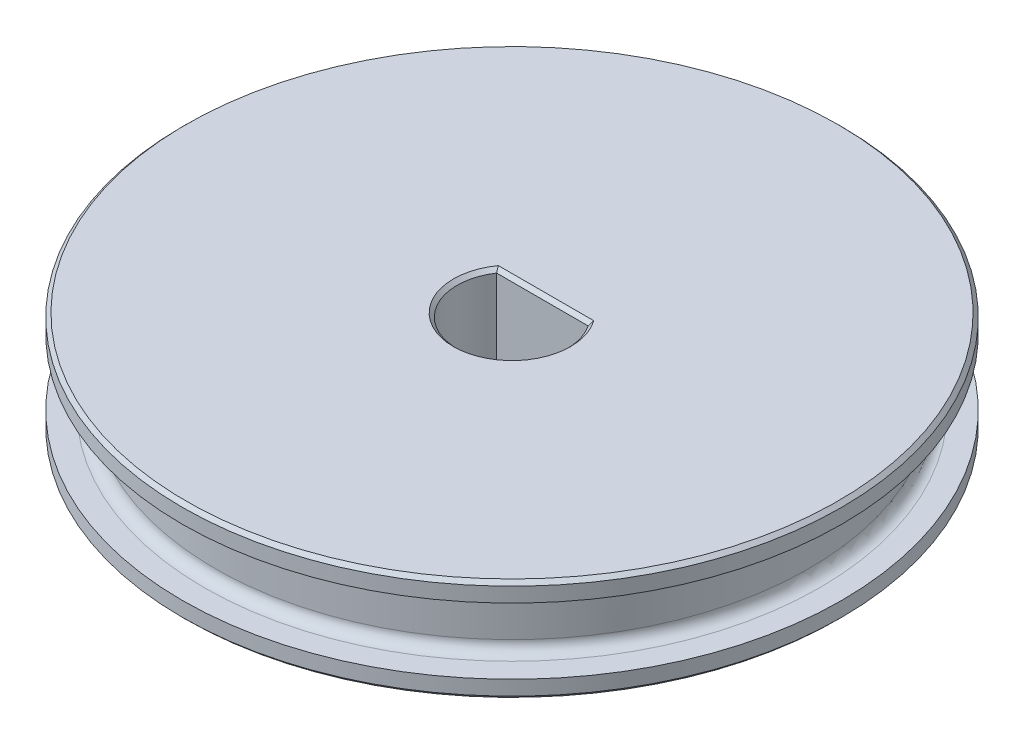
ISO-10303-21;
HEADER;
FILE_DESCRIPTION(('STEP AP214'),'2;1');
FILE_NAME('part.step','',(''),(''),'','','');
FILE_SCHEMA(('AUTOMOTIVE_DESIGN { 1 0 10303 214 1 1 1 1 }'));
ENDSEC;
DATA;
#1=APPLICATION_CONTEXT('core data for automotive mechanical design processes');
#2=APPLICATION_PROTOCOL_DEFINITION('international standard','automotive_design',2000,#1);
#3=PRODUCT_CONTEXT('',#1,'mechanical');
#4=PRODUCT('Part','Part','',(#3));
#5=PRODUCT_RELATED_PRODUCT_CATEGORY('part','',(#4));
#6=PRODUCT_DEFINITION_FORMATION('','',#4);
#7=PRODUCT_DEFINITION_CONTEXT('part definition',#1,'design');
#8=PRODUCT_DEFINITION('design','',#6,#7);
#9=PRODUCT_DEFINITION_SHAPE('','',#8);
#10=(LENGTH_UNIT() NAMED_UNIT(*) SI_UNIT(.MILLI.,.METRE.));
#11=(NAMED_UNIT(*) PLANE_ANGLE_UNIT() SI_UNIT($,.RADIAN.));
#12=(NAMED_UNIT(*) SI_UNIT($,.STERADIAN.) SOLID_ANGLE_UNIT());
#13=UNCERTAINTY_MEASURE_WITH_UNIT(LENGTH_MEASURE(1.E-05),#10,'distance_accuracy_value','');
#14=(GEOMETRIC_REPRESENTATION_CONTEXT(3) GLOBAL_UNCERTAINTY_ASSIGNED_CONTEXT((#13)) GLOBAL_UNIT_ASSIGNED_CONTEXT((#10,
#11,#12)) REPRESENTATION_CONTEXT('',''));
#15=CARTESIAN_POINT('',(0.,0.,0.));
#16=DIRECTION('',(0.,0.,1.));
#17=DIRECTION('',(1.,0.,0.));
#18=AXIS2_PLACEMENT_3D('',#15,#16,#17);
#19=CARTESIAN_POINT('',(0.,5.6,0.));
#20=DIRECTION('',(0.,-1.,0.));
#21=DIRECTION('',(0.,0.,-1.));
#22=AXIS2_PLACEMENT_3D('',#19,#20,#21);
#23=PLANE('',#22);
#24=CARTESIAN_POINT('',(0.,5.6,0.));
#25=DIRECTION('',(0.,-1.,0.));
#26=DIRECTION('',(0.,0.,-1.));
#27=AXIS2_PLACEMENT_3D('',#24,#25,#26);
#28=CIRCLE('',#27,17.8);
#29=CARTESIAN_POINT('',(0.,5.6,-17.8));
#30=VERTEX_POINT('',#29);
#31=EDGE_CURVE('E165',#30,#30,#28,.F.);
#32=ORIENTED_EDGE('',*,*,#31,.T.);
#33=EDGE_LOOP('',(#32));
#34=FACE_BOUND('',#33,.T.);
#35=CARTESIAN_POINT('',(0.,5.6,0.));
#36=DIRECTION('',(0.,-1.,0.));
#37=DIRECTION('',(0.,0.,-1.));
#38=AXIS2_PLACEMENT_3D('',#35,#36,#37);
#39=CIRCLE('',#38,3.19999999999999);
#40=CARTESIAN_POINT('',(2.60512476513677,5.6,-1.85831239517769));
#41=VERTEX_POINT('',#40);
#42=CARTESIAN_POINT('',(-2.60512476513677,5.6,-1.85831239517769));
#43=VERTEX_POINT('',#42);
#44=EDGE_CURVE('E97',#41,#43,#39,.T.);
#45=ORIENTED_EDGE('',*,*,#44,.T.);
#46=DIRECTION('',(1.,0.,0.));
#47=VECTOR('',#46,1.);
#48=CARTESIAN_POINT('',(2.5,5.6,-1.85831239517769));
#49=LINE('',#48,#47);
#50=EDGE_CURVE('E87',#43,#41,#49,.T.);
#51=ORIENTED_EDGE('',*,*,#50,.T.);
#52=EDGE_LOOP('',(#45,#51));
#53=FACE_BOUND('',#52,.T.);
#54=ADVANCED_FACE('F38',(#34,#53),#23,.F.);
#55=CARTESIAN_POINT('',(0.,0.,0.));
#56=DIRECTION('',(0.,1.,0.));
#57=DIRECTION('',(0.,0.,1.));
#58=AXIS2_PLACEMENT_3D('',#55,#56,#57);
#59=PLANE('',#58);
#60=CARTESIAN_POINT('',(0.,0.,0.));
#61=DIRECTION('',(0.,1.,0.));
#62=DIRECTION('',(0.,0.,1.));
#63=AXIS2_PLACEMENT_3D('',#60,#61,#62);
#64=CIRCLE('',#63,17.8);
#65=CARTESIAN_POINT('',(0.,0.,17.8));
#66=VERTEX_POINT('',#65);
#67=EDGE_CURVE('E47',#66,#66,#64,.F.);
#68=ORIENTED_EDGE('',*,*,#67,.T.);
#69=EDGE_LOOP('',(#68));
#70=FACE_BOUND('',#69,.T.);
#71=DIRECTION('',(-1.,0.,0.));
#72=VECTOR('',#71,1.);
#73=CARTESIAN_POINT('',(-2.5,0.,-1.8583123951777));
#74=LINE('',#73,#72);
#75=CARTESIAN_POINT('',(2.60512476513677,0.,-1.8583123951777));
#76=VERTEX_POINT('',#75);
#77=CARTESIAN_POINT('',(-2.60512476513677,0.,-1.8583123951777));
#78=VERTEX_POINT('',#77);
#79=EDGE_CURVE('E53',#76,#78,#74,.T.);
#80=ORIENTED_EDGE('',*,*,#79,.T.);
#81=CARTESIAN_POINT('',(0.,0.,0.));
#82=DIRECTION('',(0.,1.,0.));
#83=DIRECTION('',(0.,0.,1.));
#84=AXIS2_PLACEMENT_3D('',#81,#82,#83);
#85=CIRCLE('',#84,3.2);
#86=EDGE_CURVE('E121',#78,#76,#85,.T.);
#87=ORIENTED_EDGE('',*,*,#86,.T.);
#88=EDGE_LOOP('',(#80,#87));
#89=FACE_BOUND('',#88,.T.);
#90=ADVANCED_FACE('F172',(#70,#89),#59,.F.);
#91=CARTESIAN_POINT('',(0.,4.6,0.));
#92=DIRECTION('',(0.,1.,0.));
#93=DIRECTION('',(0.,0.,1.));
#94=AXIS2_PLACEMENT_3D('',#91,#92,#93);
#95=PLANE('',#94);
#96=CARTESIAN_POINT('',(0.,4.6,0.));
#97=DIRECTION('',(0.,1.,0.));
#98=DIRECTION('',(0.,0.,1.));
#99=AXIS2_PLACEMENT_3D('',#96,#97,#98);
#100=CIRCLE('',#99,16.8);
#101=CARTESIAN_POINT('',(0.,4.6,16.8));
#102=VERTEX_POINT('',#101);
#103=EDGE_CURVE('E219',#102,#102,#100,.T.);
#104=ORIENTED_EDGE('',*,*,#103,.T.);
#105=EDGE_LOOP('',(#104));
#106=FACE_BOUND('',#105,.T.);
#107=CARTESIAN_POINT('',(0.,4.6,0.));
#108=DIRECTION('',(0.,-1.,0.));
#109=DIRECTION('',(0.,0.,-1.));
#110=AXIS2_PLACEMENT_3D('',#107,#108,#109);
#111=CIRCLE('',#110,18.);
#112=CARTESIAN_POINT('',(0.,4.6,-18.));
#113=VERTEX_POINT('',#112);
#114=EDGE_CURVE('E234',#113,#113,#111,.T.);
#115=ORIENTED_EDGE('',*,*,#114,.T.);
#116=EDGE_LOOP('',(#115));
#117=FACE_BOUND('',#116,.T.);
#118=ADVANCED_FACE('F188',(#106,#117),#95,.F.);
#119=CARTESIAN_POINT('',(0.,0.,0.));
#120=DIRECTION('',(0.,-1.,0.));
#121=DIRECTION('',(0.,0.,-1.));
#122=AXIS2_PLACEMENT_3D('',#119,#120,#121);
#123=CYLINDRICAL_SURFACE('',#122,16.2);
#124=CARTESIAN_POINT('',(0.,4.,0.));
#125=DIRECTION('',(0.,1.,0.));
#126=DIRECTION('',(0.,0.,1.));
#127=AXIS2_PLACEMENT_3D('',#124,#125,#126);
#128=CIRCLE('',#127,16.2);
#129=CARTESIAN_POINT('',(0.,4.,16.2));
#130=VERTEX_POINT('',#129);
#131=EDGE_CURVE('E222',#130,#130,#128,.F.);
#132=ORIENTED_EDGE('',*,*,#131,.T.);
#133=EDGE_LOOP('',(#132));
#134=FACE_BOUND('',#133,.T.);
#135=CARTESIAN_POINT('',(0.,1.6,0.));
#136=DIRECTION('',(0.,-1.,0.));
#137=DIRECTION('',(0.,0.,-1.));
#138=AXIS2_PLACEMENT_3D('',#135,#136,#137);
#139=CIRCLE('',#138,16.2);
#140=CARTESIAN_POINT('',(0.,1.6,-16.2));
#141=VERTEX_POINT('',#140);
#142=EDGE_CURVE('E215',#141,#141,#139,.F.);
#143=ORIENTED_EDGE('',*,*,#142,.T.);
#144=EDGE_LOOP('',(#143));
#145=FACE_BOUND('',#144,.T.);
#146=ADVANCED_FACE('F199',(#134,#145),#123,.T.);
#147=CARTESIAN_POINT('',(0.,1.,0.));
#148=DIRECTION('',(0.,-1.,0.));
#149=DIRECTION('',(0.,0.,-1.));
#150=AXIS2_PLACEMENT_3D('',#147,#148,#149);
#151=PLANE('',#150);
#152=CARTESIAN_POINT('',(0.,1.,0.));
#153=DIRECTION('',(0.,-1.,0.));
#154=DIRECTION('',(0.,0.,-1.));
#155=AXIS2_PLACEMENT_3D('',#152,#153,#154);
#156=CIRCLE('',#155,16.8);
#157=CARTESIAN_POINT('',(0.,1.,-16.8));
#158=VERTEX_POINT('',#157);
#159=EDGE_CURVE('E101',#158,#158,#156,.T.);
#160=ORIENTED_EDGE('',*,*,#159,.T.);
#161=EDGE_LOOP('',(#160));
#162=FACE_BOUND('',#161,.T.);
#163=CARTESIAN_POINT('',(0.,1.,0.));
#164=DIRECTION('',(0.,-1.,0.));
#165=DIRECTION('',(0.,0.,-1.));
#166=AXIS2_PLACEMENT_3D('',#163,#164,#165);
#167=CIRCLE('',#166,18.);
#168=CARTESIAN_POINT('',(0.,1.,-18.));
#169=VERTEX_POINT('',#168);
#170=EDGE_CURVE('E230',#169,#169,#167,.T.);
#171=ORIENTED_EDGE('',*,*,#170,.F.);
#172=EDGE_LOOP('',(#171));
#173=FACE_BOUND('',#172,.T.);
#174=ADVANCED_FACE('F200',(#162,#173),#151,.F.);
#175=CARTESIAN_POINT('',(0.,0.,0.));
#176=DIRECTION('',(0.,-1.,0.));
#177=DIRECTION('',(0.,0.,-1.));
#178=AXIS2_PLACEMENT_3D('',#175,#176,#177);
#179=CYLINDRICAL_SURFACE('',#178,18.);
#180=CARTESIAN_POINT('',(0.,5.4,0.));
#181=DIRECTION('',(0.,-1.,0.));
#182=DIRECTION('',(0.,0.,-1.));
#183=AXIS2_PLACEMENT_3D('',#180,#181,#182);
#184=CIRCLE('',#183,18.);
#185=CARTESIAN_POINT('',(0.,5.4,-18.));
#186=VERTEX_POINT('',#185);
#187=EDGE_CURVE('E123',#186,#186,#184,.T.);
#188=ORIENTED_EDGE('',*,*,#187,.T.);
#189=EDGE_LOOP('',(#188));
#190=FACE_BOUND('',#189,.T.);
#191=ORIENTED_EDGE('',*,*,#114,.F.);
#192=EDGE_LOOP('',(#191));
#193=FACE_BOUND('',#192,.T.);
#194=ADVANCED_FACE('F192',(#190,#193),#179,.T.);
#195=CARTESIAN_POINT('',(0.,0.,0.));
#196=DIRECTION('',(0.,-1.,0.));
#197=DIRECTION('',(0.,0.,-1.));
#198=AXIS2_PLACEMENT_3D('',#195,#196,#197);
#199=CYLINDRICAL_SURFACE('',#198,18.);
#200=CARTESIAN_POINT('',(0.,0.199999999999995,0.));
#201=DIRECTION('',(0.,1.,0.));
#202=DIRECTION('',(0.,0.,1.));
#203=AXIS2_PLACEMENT_3D('',#200,#201,#202);
#204=CIRCLE('',#203,18.);
#205=CARTESIAN_POINT('',(0.,0.199999999999995,18.));
#206=VERTEX_POINT('',#205);
#207=EDGE_CURVE('E11',#206,#206,#204,.T.);
#208=ORIENTED_EDGE('',*,*,#207,.T.);
#209=EDGE_LOOP('',(#208));
#210=FACE_BOUND('',#209,.T.);
#211=ORIENTED_EDGE('',*,*,#170,.T.);
#212=EDGE_LOOP('',(#211));
#213=FACE_BOUND('',#212,.T.);
#214=ADVANCED_FACE('F190',(#210,#213),#199,.T.);
#215=CARTESIAN_POINT('',(0.,0.,-1.6583123951777));
#216=DIRECTION('',(0.,0.,1.));
#217=DIRECTION('',(1.,0.,0.));
#218=AXIS2_PLACEMENT_3D('',#215,#216,#217);
#219=PLANE('',#218);
#220=DIRECTION('',(0.,1.,0.));
#221=VECTOR('',#220,1.);
#222=CARTESIAN_POINT('',(2.5,0.,-1.6583123951777));
#223=LINE('',#222,#221);
#224=CARTESIAN_POINT('',(2.5,0.199999999999999,-1.6583123951777));
#225=VERTEX_POINT('',#224);
#226=CARTESIAN_POINT('',(2.5,5.40000000000001,-1.6583123951777));
#227=VERTEX_POINT('',#226);
#228=EDGE_CURVE('E238',#225,#227,#223,.T.);
#229=ORIENTED_EDGE('',*,*,#228,.T.);
#230=DIRECTION('',(-1.,0.,0.));
#231=VECTOR('',#230,1.);
#232=CARTESIAN_POINT('',(-2.5,5.40000000000001,-1.6583123951777));
#233=LINE('',#232,#231);
#234=CARTESIAN_POINT('',(-2.5,5.40000000000001,-1.6583123951777));
#235=VERTEX_POINT('',#234);
#236=EDGE_CURVE('E89',#227,#235,#233,.T.);
#237=ORIENTED_EDGE('',*,*,#236,.T.);
#238=DIRECTION('',(0.,1.,0.));
#239=VECTOR('',#238,1.);
#240=CARTESIAN_POINT('',(-2.5,0.,-1.6583123951777));
#241=LINE('',#240,#239);
#242=CARTESIAN_POINT('',(-2.5,0.199999999999999,-1.6583123951777));
#243=VERTEX_POINT('',#242);
#244=EDGE_CURVE('E239',#243,#235,#241,.T.);
#245=ORIENTED_EDGE('',*,*,#244,.F.);
#246=DIRECTION('',(1.,0.,0.));
#247=VECTOR('',#246,1.);
#248=CARTESIAN_POINT('',(2.5,0.199999999999999,-1.6583123951777));
#249=LINE('',#248,#247);
#250=EDGE_CURVE('E104',#243,#225,#249,.T.);
#251=ORIENTED_EDGE('',*,*,#250,.T.);
#252=EDGE_LOOP('',(#229,#237,#245,#251));
#253=FACE_BOUND('',#252,.T.);
#254=ADVANCED_FACE('F197',(#253),#219,.T.);
#255=CARTESIAN_POINT('',(0.,0.,0.));
#256=DIRECTION('',(0.,1.,0.));
#257=DIRECTION('',(0.,0.,1.));
#258=AXIS2_PLACEMENT_3D('',#255,#256,#257);
#259=CYLINDRICAL_SURFACE('',#258,3.);
#260=ORIENTED_EDGE('',*,*,#244,.T.);
#261=CARTESIAN_POINT('',(0.,5.40000000000001,0.));
#262=DIRECTION('',(0.,-1.,0.));
#263=DIRECTION('',(0.,0.,-1.));
#264=AXIS2_PLACEMENT_3D('',#261,#262,#263);
#265=CIRCLE('',#264,3.);
#266=EDGE_CURVE('E116',#235,#227,#265,.F.);
#267=ORIENTED_EDGE('',*,*,#266,.T.);
#268=ORIENTED_EDGE('',*,*,#228,.F.);
#269=CARTESIAN_POINT('',(0.,0.199999999999999,0.));
#270=DIRECTION('',(0.,1.,0.));
#271=DIRECTION('',(0.,0.,1.));
#272=AXIS2_PLACEMENT_3D('',#269,#270,#271);
#273=CIRCLE('',#272,3.);
#274=EDGE_CURVE('E112',#225,#243,#273,.F.);
#275=ORIENTED_EDGE('',*,*,#274,.T.);
#276=EDGE_LOOP('',(#260,#267,#268,#275));
#277=FACE_BOUND('',#276,.T.);
#278=ADVANCED_FACE('F206',(#277),#259,.F.);
#279=CARTESIAN_POINT('',(0.,4.,0.));
#280=DIRECTION('',(0.,1.,0.));
#281=DIRECTION('',(0.,0.,1.));
#282=AXIS2_PLACEMENT_3D('',#279,#280,#281);
#283=TOROIDAL_SURFACE('',#282,16.8,0.6);
#284=ORIENTED_EDGE('',*,*,#103,.F.);
#285=EDGE_LOOP('',(#284));
#286=FACE_BOUND('',#285,.T.);
#287=ORIENTED_EDGE('',*,*,#131,.F.);
#288=EDGE_LOOP('',(#287));
#289=FACE_BOUND('',#288,.T.);
#290=ADVANCED_FACE('F204',(#286,#289),#283,.F.);
#291=CARTESIAN_POINT('',(0.,1.6,0.));
#292=DIRECTION('',(0.,-1.,0.));
#293=DIRECTION('',(0.,0.,-1.));
#294=AXIS2_PLACEMENT_3D('',#291,#292,#293);
#295=TOROIDAL_SURFACE('',#294,16.8,0.6);
#296=ORIENTED_EDGE('',*,*,#142,.F.);
#297=EDGE_LOOP('',(#296));
#298=FACE_BOUND('',#297,.T.);
#299=ORIENTED_EDGE('',*,*,#159,.F.);
#300=EDGE_LOOP('',(#299));
#301=FACE_BOUND('',#300,.T.);
#302=ADVANCED_FACE('F141',(#298,#301),#295,.F.);
#303=CARTESIAN_POINT('',(0.,5.40000000000001,0.));
#304=DIRECTION('',(0.,1.,0.));
#305=DIRECTION('',(0.,0.,1.));
#306=AXIS2_PLACEMENT_3D('',#303,#304,#305);
#307=CONICAL_SURFACE('',#306,3.,0.78539816339746);
#308=CARTESIAN_POINT('',(2.60512476513677,5.6,-1.85831239517769));
#309=CARTESIAN_POINT('',(2.58792094941289,5.56658337478567,-1.82489576996336));
#310=CARTESIAN_POINT('',(2.57055864770884,5.53320840157479,-1.79152079675248));
#311=CARTESIAN_POINT('',(2.53551705956111,5.46654173484736,-1.72485413002505));
#312=CARTESIAN_POINT('',(2.51783777288625,5.43325004139158,-1.69156243656927));
#313=CARTESIAN_POINT('',(2.50000000000001,5.40000000000001,-1.6583123951777));
#314=B_SPLINE_CURVE_WITH_KNOTS('',3,(#308,#309,#310,#311,#312,#313),.UNSPECIFIED.,.F.,.F.,(4,2,
4),(0.,0.150874268008331,0.301748646060932),.UNSPECIFIED.);
#315=EDGE_CURVE('E83',#227,#41,#314,.F.);
#316=ORIENTED_EDGE('',*,*,#315,.F.);
#317=ORIENTED_EDGE('',*,*,#266,.F.);
#318=CARTESIAN_POINT('',(-2.5,5.40000000000001,-1.6583123951777));
#319=CARTESIAN_POINT('',(-2.51783777288624,5.43325004139158,-1.69156243656927));
#320=CARTESIAN_POINT('',(-2.5355170595611,5.46654173484736,-1.72485413002506));
#321=CARTESIAN_POINT('',(-2.57055864770884,5.53320840157479,-1.79152079675248));
#322=CARTESIAN_POINT('',(-2.5879209494129,5.56658337478566,-1.82489576996336));
#323=CARTESIAN_POINT('',(-2.60512476513679,5.6,-1.85831239517769));
#324=B_SPLINE_CURVE_WITH_KNOTS('',3,(#318,#319,#320,#321,#322,#323),.UNSPECIFIED.,.F.,.F.,(4,2,
4),(0.,0.150874378052601,0.301748646060932),.UNSPECIFIED.);
#325=EDGE_CURVE('E93',#43,#235,#324,.F.);
#326=ORIENTED_EDGE('',*,*,#325,.F.);
#327=ORIENTED_EDGE('',*,*,#44,.F.);
#328=EDGE_LOOP('',(#316,#317,#326,#327));
#329=FACE_BOUND('',#328,.T.);
#330=ADVANCED_FACE('F98',(#329),#307,.F.);
#331=CARTESIAN_POINT('',(0.,5.6,-1.85831239517769));
#332=DIRECTION('',(0.,0.707106781186556,0.707106781186539));
#333=DIRECTION('',(-1.,0.,0.));
#334=AXIS2_PLACEMENT_3D('',#331,#332,#333);
#335=PLANE('',#334);
#336=ORIENTED_EDGE('',*,*,#325,.T.);
#337=ORIENTED_EDGE('',*,*,#236,.F.);
#338=ORIENTED_EDGE('',*,*,#315,.T.);
#339=ORIENTED_EDGE('',*,*,#50,.F.);
#340=EDGE_LOOP('',(#336,#337,#338,#339));
#341=FACE_BOUND('',#340,.T.);
#342=ADVANCED_FACE('F85',(#341),#335,.T.);
#343=CARTESIAN_POINT('',(0.,0.199999999999999,-1.6583123951777));
#344=DIRECTION('',(0.,-0.707106781186548,0.707106781186548));
#345=DIRECTION('',(-1.,0.,0.));
#346=AXIS2_PLACEMENT_3D('',#343,#344,#345);
#347=PLANE('',#346);
#348=CARTESIAN_POINT('',(2.60512476513677,0.,-1.8583123951777));
#349=CARTESIAN_POINT('',(2.58792094941289,0.0334166252143343,-1.82489576996336));
#350=CARTESIAN_POINT('',(2.57055864770884,0.0667915984252163,-1.79152079675248));
#351=CARTESIAN_POINT('',(2.53551705956111,0.133458265152644,-1.72485413002506));
#352=CARTESIAN_POINT('',(2.51783777288625,0.166749958608429,-1.69156243656927));
#353=CARTESIAN_POINT('',(2.50000000000001,0.200000000000002,-1.6583123951777));
#354=B_SPLINE_CURVE_WITH_KNOTS('',3,(#348,#349,#350,#351,#352,#353),.UNSPECIFIED.,.F.,.F.,(4,2,
4),(0.,0.150874268008335,0.301748646060939),.UNSPECIFIED.);
#355=EDGE_CURVE('E61',#225,#76,#354,.F.);
#356=ORIENTED_EDGE('',*,*,#355,.F.);
#357=ORIENTED_EDGE('',*,*,#250,.F.);
#358=CARTESIAN_POINT('',(-2.5,0.199999999999999,-1.6583123951777));
#359=CARTESIAN_POINT('',(-2.51783777288624,0.166749958608427,-1.69156243656927));
#360=CARTESIAN_POINT('',(-2.53551705956111,0.133458265152642,-1.72485413002506));
#361=CARTESIAN_POINT('',(-2.57055864770884,0.0667915984252177,-1.79152079675248));
#362=CARTESIAN_POINT('',(-2.5879209494129,0.0334166252143375,-1.82489576996336));
#363=CARTESIAN_POINT('',(-2.60512476513679,0.,-1.85831239517769));
#364=B_SPLINE_CURVE_WITH_KNOTS('',3,(#358,#359,#360,#361,#362,#363),.UNSPECIFIED.,.F.,.F.,(4,2,
4),(0.,0.150874378052604,0.301748646060939),.UNSPECIFIED.);
#365=EDGE_CURVE('E94',#78,#243,#364,.F.);
#366=ORIENTED_EDGE('',*,*,#365,.F.);
#367=ORIENTED_EDGE('',*,*,#79,.F.);
#368=EDGE_LOOP('',(#356,#357,#366,#367));
#369=FACE_BOUND('',#368,.T.);
#370=ADVANCED_FACE('F148',(#369),#347,.T.);
#371=CARTESIAN_POINT('',(0.,0.,0.));
#372=DIRECTION('',(0.,-1.,0.));
#373=DIRECTION('',(0.,0.,-1.));
#374=AXIS2_PLACEMENT_3D('',#371,#372,#373);
#375=CONICAL_SURFACE('',#374,3.2,0.785398163397448);
#376=ORIENTED_EDGE('',*,*,#365,.T.);
#377=ORIENTED_EDGE('',*,*,#274,.F.);
#378=ORIENTED_EDGE('',*,*,#355,.T.);
#379=ORIENTED_EDGE('',*,*,#86,.F.);
#380=EDGE_LOOP('',(#376,#377,#378,#379));
#381=FACE_BOUND('',#380,.T.);
#382=ADVANCED_FACE('F142',(#381),#375,.F.);
#383=CARTESIAN_POINT('',(0.,5.4,0.));
#384=DIRECTION('',(0.,-1.,0.));
#385=DIRECTION('',(0.,0.,-1.));
#386=AXIS2_PLACEMENT_3D('',#383,#384,#385);
#387=CONICAL_SURFACE('',#386,18.,0.785398163397448);
#388=ORIENTED_EDGE('',*,*,#31,.F.);
#389=EDGE_LOOP('',(#388));
#390=FACE_BOUND('',#389,.T.);
#391=ORIENTED_EDGE('',*,*,#187,.F.);
#392=EDGE_LOOP('',(#391));
#393=FACE_BOUND('',#392,.T.);
#394=ADVANCED_FACE('F147',(#390,#393),#387,.T.);
#395=CARTESIAN_POINT('',(0.,0.,0.));
#396=DIRECTION('',(0.,1.,0.));
#397=DIRECTION('',(0.,0.,1.));
#398=AXIS2_PLACEMENT_3D('',#395,#396,#397);
#399=CONICAL_SURFACE('',#398,17.8,0.785398163397448);
#400=ORIENTED_EDGE('',*,*,#207,.F.);
#401=EDGE_LOOP('',(#400));
#402=FACE_BOUND('',#401,.T.);
#403=ORIENTED_EDGE('',*,*,#67,.F.);
#404=EDGE_LOOP('',(#403));
#405=FACE_BOUND('',#404,.T.);
#406=ADVANCED_FACE('F40',(#402,#405),#399,.T.);
#407=CLOSED_SHELL('',(#54,#90,#118,#146,#174,#194,#214,#254,#278,#290,#302,#330,#342,#370,#382,
#394,#406));
#408=MANIFOLD_SOLID_BREP('B2',#407);
#409=ADVANCED_BREP_SHAPE_REPRESENTATION('',(#18,#408),#14);
#410=SHAPE_DEFINITION_REPRESENTATION(#9,#409);
ENDSEC;
END-ISO-10303-21;
